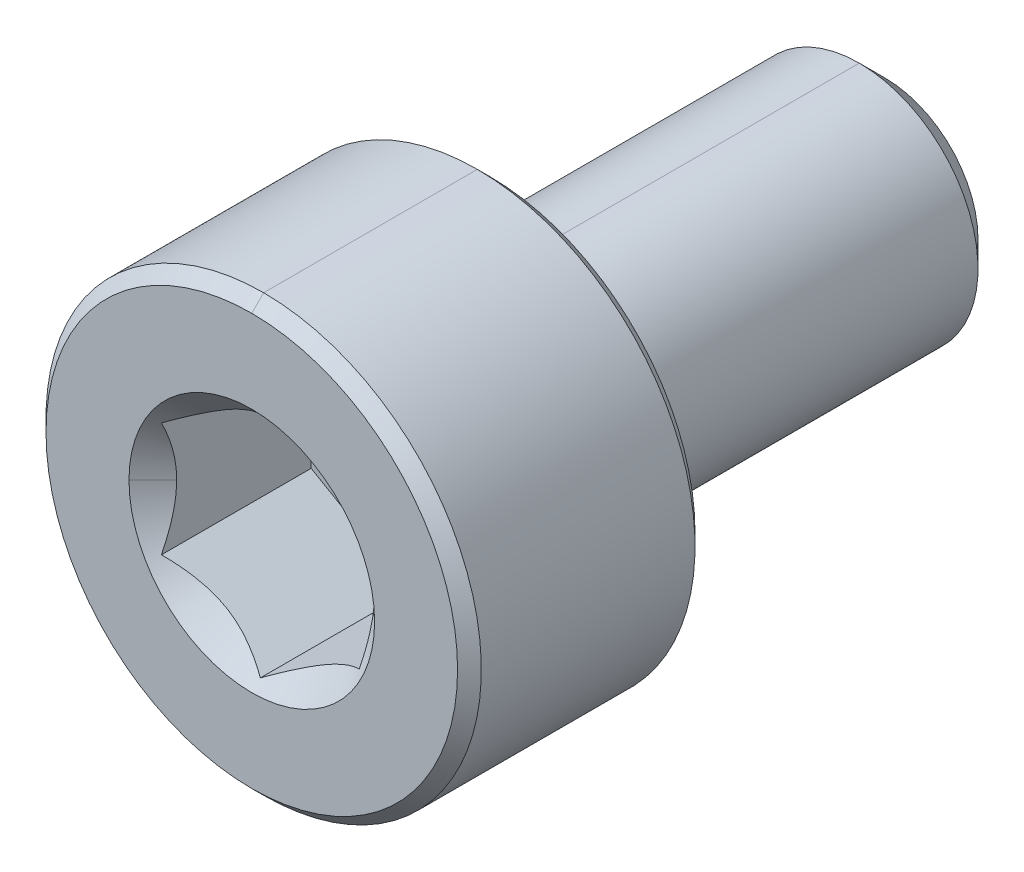
ISO-10303-21;
HEADER;
FILE_DESCRIPTION(('STEP AP214'),'2;1');
FILE_NAME('part.step','',(''),(''),'','','');
FILE_SCHEMA(('AUTOMOTIVE_DESIGN { 1 0 10303 214 1 1 1 1 }'));
ENDSEC;
DATA;
#1=APPLICATION_CONTEXT('core data for automotive mechanical design processes');
#2=APPLICATION_PROTOCOL_DEFINITION('international standard','automotive_design',2000,#1);
#3=PRODUCT_CONTEXT('',#1,'mechanical');
#4=PRODUCT('Part','Part','',(#3));
#5=PRODUCT_RELATED_PRODUCT_CATEGORY('part','',(#4));
#6=PRODUCT_DEFINITION_FORMATION('','',#4);
#7=PRODUCT_DEFINITION_CONTEXT('part definition',#1,'design');
#8=PRODUCT_DEFINITION('design','',#6,#7);
#9=PRODUCT_DEFINITION_SHAPE('','',#8);
#10=(LENGTH_UNIT() NAMED_UNIT(*) SI_UNIT(.MILLI.,.METRE.));
#11=(NAMED_UNIT(*) PLANE_ANGLE_UNIT() SI_UNIT($,.RADIAN.));
#12=(NAMED_UNIT(*) SI_UNIT($,.STERADIAN.) SOLID_ANGLE_UNIT());
#13=UNCERTAINTY_MEASURE_WITH_UNIT(LENGTH_MEASURE(1.E-05),#10,'distance_accuracy_value','');
#14=(GEOMETRIC_REPRESENTATION_CONTEXT(3) GLOBAL_UNCERTAINTY_ASSIGNED_CONTEXT((#13)) GLOBAL_UNIT_ASSIGNED_CONTEXT((#10,
#11,#12)) REPRESENTATION_CONTEXT('',''));
#15=CARTESIAN_POINT('',(0.,0.,0.));
#16=DIRECTION('',(0.,0.,1.));
#17=DIRECTION('',(1.,0.,0.));
#18=AXIS2_PLACEMENT_3D('',#15,#16,#17);
#19=CARTESIAN_POINT('',(1.25,-0.721687836487032,-2.81881307912986));
#20=DIRECTION('',(1.,0.,0.));
#21=DIRECTION('',(0.,-1.,0.));
#22=AXIS2_PLACEMENT_3D('',#19,#20,#21);
#23=PLANE('',#22);
#24=DIRECTION('',(0.,0.,1.));
#25=VECTOR('',#24,1.);
#26=CARTESIAN_POINT('',(1.25,-0.721687836487032,-2.81881307912986));
#27=LINE('',#26,#25);
#28=CARTESIAN_POINT('',(1.25,-0.721687836487032,2.));
#29=VERTEX_POINT('',#28);
#30=CARTESIAN_POINT('',(1.25,-0.721687836487032,3.89174682452694));
#31=VERTEX_POINT('',#30);
#32=EDGE_CURVE('E471',#29,#31,#27,.T.);
#33=ORIENTED_EDGE('',*,*,#32,.T.);
#34=CARTESIAN_POINT('',(1.25,-0.721687836487032,3.89174682452695));
#35=CARTESIAN_POINT('',(1.25,-0.334936490538913,3.69837115155288));
#36=CARTESIAN_POINT('',(1.25,0.,3.69837115155288));
#37=B_SPLINE_CURVE_WITH_KNOTS('',2,(#34,#35,#36),.UNSPECIFIED.,.F.,.F.,(3,3),(0.,1.),.UNSPECIFIED.);
#38=CARTESIAN_POINT('',(1.25,0.,3.69837115155289));
#39=VERTEX_POINT('',#38);
#40=EDGE_CURVE('E460',#31,#39,#37,.T.);
#41=ORIENTED_EDGE('',*,*,#40,.T.);
#42=CARTESIAN_POINT('',(1.25,0.,3.69837115155288));
#43=CARTESIAN_POINT('',(1.25,0.180809106046856,3.69837115155288));
#44=CARTESIAN_POINT('',(1.25,0.371449563482302,3.75239368901567));
#45=CARTESIAN_POINT('',(1.25,0.536554357052694,3.79918008480978));
#46=CARTESIAN_POINT('',(1.25,0.721687836487032,3.89174682452695));
#47=B_SPLINE_CURVE_WITH_KNOTS('',2,(#42,#43,#44,#45,#46),.UNSPECIFIED.,.F.,.F.,(3,2,3),(0.,0.5,
1.),.UNSPECIFIED.);
#48=CARTESIAN_POINT('',(1.25,0.721687836487032,3.89174682452694));
#49=VERTEX_POINT('',#48);
#50=EDGE_CURVE('E280',#39,#49,#47,.T.);
#51=ORIENTED_EDGE('',*,*,#50,.T.);
#52=DIRECTION('',(0.,0.,1.));
#53=VECTOR('',#52,1.);
#54=CARTESIAN_POINT('',(1.25,0.721687836487032,-2.81881307912986));
#55=LINE('',#54,#53);
#56=CARTESIAN_POINT('',(1.25,0.721687836487032,2.));
#57=VERTEX_POINT('',#56);
#58=EDGE_CURVE('E10',#57,#49,#55,.T.);
#59=ORIENTED_EDGE('',*,*,#58,.F.);
#60=DIRECTION('',(0.,1.,0.));
#61=VECTOR('',#60,1.);
#62=CARTESIAN_POINT('',(1.25,-0.721687836487032,2.));
#63=LINE('',#62,#61);
#64=EDGE_CURVE('E279',#29,#57,#63,.T.);
#65=ORIENTED_EDGE('',*,*,#64,.F.);
#66=EDGE_LOOP('',(#33,#41,#51,#59,#65));
#67=FACE_BOUND('',#66,.T.);
#68=ADVANCED_FACE('F15',(#67),#23,.F.);
#69=CARTESIAN_POINT('',(1.25,0.721687836487032,-2.81881307912986));
#70=DIRECTION('',(0.5,0.866025403784439,0.));
#71=DIRECTION('',(0.,0.,-1.));
#72=AXIS2_PLACEMENT_3D('',#69,#70,#71);
#73=PLANE('',#72);
#74=ORIENTED_EDGE('',*,*,#58,.T.);
#75=CARTESIAN_POINT('',(1.25,0.721687836487032,3.89174682452695));
#76=CARTESIAN_POINT('',(0.916560687279088,0.914199113444854,3.69923554756913));
#77=CARTESIAN_POINT('',(0.627302735621754,1.08120226969946,3.69837397959836));
#78=CARTESIAN_POINT('',(0.336432191071905,1.24913645689464,3.6975076084463));
#79=CARTESIAN_POINT('',(0.,1.44337567297406,3.89174682452695));
#80=B_SPLINE_CURVE_WITH_KNOTS('',2,(#75,#76,#77,#78,#79),.UNSPECIFIED.,.F.,.F.,(3,2,3),(0.,0.5,
1.),.UNSPECIFIED.);
#81=CARTESIAN_POINT('',(0.,1.44337567297406,3.89174682452694));
#82=VERTEX_POINT('',#81);
#83=EDGE_CURVE('E532',#49,#82,#80,.T.);
#84=ORIENTED_EDGE('',*,*,#83,.T.);
#85=DIRECTION('',(0.,0.,1.));
#86=VECTOR('',#85,1.);
#87=CARTESIAN_POINT('',(0.,1.44337567297406,-2.81881307912986));
#88=LINE('',#87,#86);
#89=CARTESIAN_POINT('',(0.,1.44337567297406,2.));
#90=VERTEX_POINT('',#89);
#91=EDGE_CURVE('E27',#90,#82,#88,.T.);
#92=ORIENTED_EDGE('',*,*,#91,.F.);
#93=DIRECTION('',(-0.866025403784439,0.5,0.));
#94=VECTOR('',#93,1.);
#95=CARTESIAN_POINT('',(1.25,0.721687836487032,2.));
#96=LINE('',#95,#94);
#97=EDGE_CURVE('E274',#57,#90,#96,.T.);
#98=ORIENTED_EDGE('',*,*,#97,.F.);
#99=EDGE_LOOP('',(#74,#84,#92,#98));
#100=FACE_BOUND('',#99,.T.);
#101=ADVANCED_FACE('F508',(#100),#73,.F.);
#102=CARTESIAN_POINT('',(0.,1.44337567297406,-2.81881307912986));
#103=DIRECTION('',(-0.5,0.866025403784439,0.));
#104=DIRECTION('',(0.,0.,1.));
#105=AXIS2_PLACEMENT_3D('',#102,#103,#104);
#106=PLANE('',#105);
#107=ORIENTED_EDGE('',*,*,#91,.T.);
#108=CARTESIAN_POINT('',(0.,1.44337567297406,3.89174682452695));
#109=CARTESIAN_POINT('',(-0.333439312720449,1.25086439601651,3.6992355475694));
#110=CARTESIAN_POINT('',(-0.622697264378245,1.08386123976164,3.69837397959836));
#111=CARTESIAN_POINT('',(-0.913567808927633,0.915927052566719,3.69750760844603));
#112=CARTESIAN_POINT('',(-1.25,0.721687836487032,3.89174682452695));
#113=B_SPLINE_CURVE_WITH_KNOTS('',2,(#108,#109,#110,#111,#112),.UNSPECIFIED.,.F.,.F.,(3,2,3),
(0.,0.5,1.),.UNSPECIFIED.);
#114=CARTESIAN_POINT('',(-1.25,0.721687836487032,3.89174682452694));
#115=VERTEX_POINT('',#114);
#116=EDGE_CURVE('E533',#82,#115,#113,.T.);
#117=ORIENTED_EDGE('',*,*,#116,.T.);
#118=DIRECTION('',(0.,0.,1.));
#119=VECTOR('',#118,1.);
#120=CARTESIAN_POINT('',(-1.25,0.721687836487032,-2.81881307912986));
#121=LINE('',#120,#119);
#122=CARTESIAN_POINT('',(-1.25,0.721687836487032,2.));
#123=VERTEX_POINT('',#122);
#124=EDGE_CURVE('E52',#123,#115,#121,.T.);
#125=ORIENTED_EDGE('',*,*,#124,.F.);
#126=DIRECTION('',(-0.866025403784439,-0.5,0.));
#127=VECTOR('',#126,1.);
#128=CARTESIAN_POINT('',(0.,1.44337567297406,2.));
#129=LINE('',#128,#127);
#130=EDGE_CURVE('E269',#90,#123,#129,.T.);
#131=ORIENTED_EDGE('',*,*,#130,.F.);
#132=EDGE_LOOP('',(#107,#117,#125,#131));
#133=FACE_BOUND('',#132,.T.);
#134=ADVANCED_FACE('F374',(#133),#106,.F.);
#135=CARTESIAN_POINT('',(-1.25,0.721687836487032,-2.81881307912986));
#136=DIRECTION('',(-1.,0.,0.));
#137=DIRECTION('',(0.,1.,0.));
#138=AXIS2_PLACEMENT_3D('',#135,#136,#137);
#139=PLANE('',#138);
#140=ORIENTED_EDGE('',*,*,#124,.T.);
#141=CARTESIAN_POINT('',(-1.25,0.721687836487032,3.89174682452695));
#142=CARTESIAN_POINT('',(-1.25,0.538824359635457,3.80031508610115));
#143=CARTESIAN_POINT('',(-1.25,0.371449563482303,3.75239368901567));
#144=CARTESIAN_POINT('',(-1.25,0.182765348383529,3.69837115155288));
#145=CARTESIAN_POINT('',(-1.25,0.,3.69837115155288));
#146=B_SPLINE_CURVE_WITH_KNOTS('',2,(#141,#142,#143,#144,#145),.UNSPECIFIED.,.F.,.F.,(3,2,3),
(0.,0.5,1.),.UNSPECIFIED.);
#147=CARTESIAN_POINT('',(-1.25,0.,3.69837115155288));
#148=VERTEX_POINT('',#147);
#149=EDGE_CURVE('E268',#115,#148,#146,.T.);
#150=ORIENTED_EDGE('',*,*,#149,.T.);
#151=CARTESIAN_POINT('',(-1.25,0.,3.69837115155288));
#152=CARTESIAN_POINT('',(-1.25,-0.334936490538916,3.69837115155288));
#153=CARTESIAN_POINT('',(-1.25,-0.721687836487032,3.89174682452695));
#154=B_SPLINE_CURVE_WITH_KNOTS('',2,(#151,#152,#153),.UNSPECIFIED.,.F.,.F.,(3,3),(0.,1.),.UNSPECIFIED.);
#155=CARTESIAN_POINT('',(-1.25,-0.721687836487032,3.89174682452694));
#156=VERTEX_POINT('',#155);
#157=EDGE_CURVE('E392',#148,#156,#154,.T.);
#158=ORIENTED_EDGE('',*,*,#157,.T.);
#159=DIRECTION('',(0.,0.,1.));
#160=VECTOR('',#159,1.);
#161=CARTESIAN_POINT('',(-1.25,-0.721687836487032,-2.81881307912986));
#162=LINE('',#161,#160);
#163=CARTESIAN_POINT('',(-1.25,-0.721687836487033,2.));
#164=VERTEX_POINT('',#163);
#165=EDGE_CURVE('E41',#164,#156,#162,.T.);
#166=ORIENTED_EDGE('',*,*,#165,.F.);
#167=DIRECTION('',(0.,-1.,0.));
#168=VECTOR('',#167,1.);
#169=CARTESIAN_POINT('',(-1.25,0.721687836487032,2.));
#170=LINE('',#169,#168);
#171=EDGE_CURVE('E273',#123,#164,#170,.T.);
#172=ORIENTED_EDGE('',*,*,#171,.F.);
#173=EDGE_LOOP('',(#140,#150,#158,#166,#172));
#174=FACE_BOUND('',#173,.T.);
#175=ADVANCED_FACE('F364',(#174),#139,.F.);
#176=CARTESIAN_POINT('',(-1.25,-0.721687836487032,-2.81881307912986));
#177=DIRECTION('',(-0.5,-0.866025403784439,0.));
#178=DIRECTION('',(-0.866025403784439,0.5,0.));
#179=AXIS2_PLACEMENT_3D('',#176,#177,#178);
#180=PLANE('',#179);
#181=ORIENTED_EDGE('',*,*,#165,.T.);
#182=CARTESIAN_POINT('',(-1.25,-0.721687836487032,3.89174682452695));
#183=CARTESIAN_POINT('',(-0.916560687277686,-0.914199113445663,3.69923554756832));
#184=CARTESIAN_POINT('',(-0.627302735621755,-1.08120226969945,3.69837397959837));
#185=CARTESIAN_POINT('',(-0.336432191070502,-1.24913645689545,3.69750760844712));
#186=CARTESIAN_POINT('',(0.,-1.44337567297406,3.89174682452695));
#187=B_SPLINE_CURVE_WITH_KNOTS('',2,(#182,#183,#184,#185,#186),.UNSPECIFIED.,.F.,.F.,(3,2,3),
(0.,0.5,1.),.UNSPECIFIED.);
#188=CARTESIAN_POINT('',(0.,-1.44337567297406,3.89174682452694));
#189=VERTEX_POINT('',#188);
#190=EDGE_CURVE('E398',#156,#189,#187,.T.);
#191=ORIENTED_EDGE('',*,*,#190,.T.);
#192=DIRECTION('',(0.,0.,1.));
#193=VECTOR('',#192,1.);
#194=CARTESIAN_POINT('',(0.,-1.44337567297406,-2.81881307912986));
#195=LINE('',#194,#193);
#196=CARTESIAN_POINT('',(0.,-1.44337567297406,2.));
#197=VERTEX_POINT('',#196);
#198=EDGE_CURVE('E294',#197,#189,#195,.T.);
#199=ORIENTED_EDGE('',*,*,#198,.F.);
#200=DIRECTION('',(0.866025403784439,-0.5,0.));
#201=VECTOR('',#200,1.);
#202=CARTESIAN_POINT('',(-1.25,-0.721687836487032,2.));
#203=LINE('',#202,#201);
#204=EDGE_CURVE('E290',#164,#197,#203,.T.);
#205=ORIENTED_EDGE('',*,*,#204,.F.);
#206=EDGE_LOOP('',(#181,#191,#199,#205));
#207=FACE_BOUND('',#206,.T.);
#208=ADVANCED_FACE('F373',(#207),#180,.F.);
#209=CARTESIAN_POINT('',(0.,-1.44337567297406,-2.81881307912986));
#210=DIRECTION('',(0.5,-0.866025403784439,0.));
#211=DIRECTION('',(0.,0.,-1.));
#212=AXIS2_PLACEMENT_3D('',#209,#210,#211);
#213=PLANE('',#212);
#214=ORIENTED_EDGE('',*,*,#198,.T.);
#215=CARTESIAN_POINT('',(0.,-1.44337567297406,3.89174682452695));
#216=CARTESIAN_POINT('',(0.333439312721843,-1.2508643960157,3.69923554756859));
#217=CARTESIAN_POINT('',(0.622697264378245,-1.08386123976164,3.69837397959836));
#218=CARTESIAN_POINT('',(0.913567808929029,-0.915927052565913,3.69750760844683));
#219=CARTESIAN_POINT('',(1.25,-0.721687836487032,3.89174682452695));
#220=B_SPLINE_CURVE_WITH_KNOTS('',2,(#215,#216,#217,#218,#219),.UNSPECIFIED.,.F.,.F.,(3,2,3),
(0.,0.5,1.),.UNSPECIFIED.);
#221=EDGE_CURVE('E490',#189,#31,#220,.T.);
#222=ORIENTED_EDGE('',*,*,#221,.T.);
#223=ORIENTED_EDGE('',*,*,#32,.F.);
#224=DIRECTION('',(0.866025403784438,0.5,0.));
#225=VECTOR('',#224,1.);
#226=CARTESIAN_POINT('',(0.,-1.44337567297406,2.));
#227=LINE('',#226,#225);
#228=EDGE_CURVE('E275',#197,#29,#227,.T.);
#229=ORIENTED_EDGE('',*,*,#228,.F.);
#230=EDGE_LOOP('',(#214,#222,#223,#229));
#231=FACE_BOUND('',#230,.T.);
#232=ADVANCED_FACE('F493',(#231),#213,.F.);
#233=CARTESIAN_POINT('',(0.,2.6,2.));
#234=DIRECTION('',(0.,0.,-1.));
#235=DIRECTION('',(-1.,0.,0.));
#236=AXIS2_PLACEMENT_3D('',#233,#234,#235);
#237=PLANE('',#236);
#238=ORIENTED_EDGE('',*,*,#228,.T.);
#239=ORIENTED_EDGE('',*,*,#64,.T.);
#240=ORIENTED_EDGE('',*,*,#97,.T.);
#241=ORIENTED_EDGE('',*,*,#130,.T.);
#242=ORIENTED_EDGE('',*,*,#171,.T.);
#243=ORIENTED_EDGE('',*,*,#204,.T.);
#244=EDGE_LOOP('',(#238,#239,#240,#241,#242,#243));
#245=FACE_BOUND('',#244,.T.);
#246=ADVANCED_FACE('F328',(#245),#237,.F.);
#247=CARTESIAN_POINT('',(0.,0.,4.));
#248=DIRECTION('',(0.,0.,1.));
#249=DIRECTION('',(1.,0.,0.));
#250=AXIS2_PLACEMENT_3D('',#247,#248,#249);
#251=CONICAL_SURFACE('',#250,1.55162884844712,0.78539816339745);
#252=DIRECTION('',(-0.707106781186549,0.,0.707106781186546));
#253=VECTOR('',#252,1.);
#254=CARTESIAN_POINT('',(-1.55162884844712,0.,4.));
#255=LINE('',#254,#253);
#256=CARTESIAN_POINT('',(-1.55162884844712,0.,4.));
#257=VERTEX_POINT('',#256);
#258=EDGE_CURVE('E395',#148,#257,#255,.T.);
#259=ORIENTED_EDGE('',*,*,#258,.F.);
#260=ORIENTED_EDGE('',*,*,#149,.F.);
#261=ORIENTED_EDGE('',*,*,#116,.F.);
#262=ORIENTED_EDGE('',*,*,#83,.F.);
#263=ORIENTED_EDGE('',*,*,#50,.F.);
#264=DIRECTION('',(0.707106781186549,0.,0.707106781186546));
#265=VECTOR('',#264,1.);
#266=CARTESIAN_POINT('',(1.55162884844712,0.,4.));
#267=LINE('',#266,#265);
#268=CARTESIAN_POINT('',(1.55162884844712,0.,4.));
#269=VERTEX_POINT('',#268);
#270=EDGE_CURVE('E315',#39,#269,#267,.T.);
#271=ORIENTED_EDGE('',*,*,#270,.T.);
#272=CARTESIAN_POINT('',(0.,0.,4.));
#273=DIRECTION('',(0.,0.,1.));
#274=DIRECTION('',(1.,0.,0.));
#275=AXIS2_PLACEMENT_3D('',#272,#273,#274);
#276=CIRCLE('',#275,1.55162884844712);
#277=EDGE_CURVE('E265',#269,#257,#276,.T.);
#278=ORIENTED_EDGE('',*,*,#277,.T.);
#279=EDGE_LOOP('',(#259,#260,#261,#262,#263,#271,#278));
#280=FACE_BOUND('',#279,.T.);
#281=ADVANCED_FACE('F317',(#280),#251,.F.);
#282=CARTESIAN_POINT('',(0.,0.,4.));
#283=DIRECTION('',(0.,0.,1.));
#284=DIRECTION('',(0.,-1.,0.));
#285=AXIS2_PLACEMENT_3D('',#282,#283,#284);
#286=PLANE('',#285);
#287=ORIENTED_EDGE('',*,*,#277,.F.);
#288=CARTESIAN_POINT('',(0.,0.,4.));
#289=DIRECTION('',(0.,0.,1.));
#290=DIRECTION('',(1.,0.,0.));
#291=AXIS2_PLACEMENT_3D('',#288,#289,#290);
#292=CIRCLE('',#291,1.55162884844712);
#293=EDGE_CURVE('E405',#257,#269,#292,.T.);
#294=ORIENTED_EDGE('',*,*,#293,.F.);
#295=EDGE_LOOP('',(#287,#294));
#296=FACE_BOUND('',#295,.T.);
#297=CARTESIAN_POINT('',(0.,0.,4.));
#298=DIRECTION('',(0.,0.,-1.));
#299=DIRECTION('',(0.,1.,0.));
#300=AXIS2_PLACEMENT_3D('',#297,#298,#299);
#301=CIRCLE('',#300,2.6);
#302=CARTESIAN_POINT('',(0.,2.6,4.));
#303=VERTEX_POINT('',#302);
#304=CARTESIAN_POINT('',(0.,-2.6,4.));
#305=VERTEX_POINT('',#304);
#306=EDGE_CURVE('E1067',#303,#305,#301,.T.);
#307=ORIENTED_EDGE('',*,*,#306,.F.);
#308=CARTESIAN_POINT('',(0.,0.,4.));
#309=DIRECTION('',(0.,0.,-1.));
#310=DIRECTION('',(0.,1.,0.));
#311=AXIS2_PLACEMENT_3D('',#308,#309,#310);
#312=CIRCLE('',#311,2.6);
#313=EDGE_CURVE('E262',#305,#303,#312,.T.);
#314=ORIENTED_EDGE('',*,*,#313,.F.);
#315=EDGE_LOOP('',(#307,#314));
#316=FACE_BOUND('',#315,.T.);
#317=ADVANCED_FACE('F327',(#296,#316),#286,.T.);
#318=CARTESIAN_POINT('',(0.,0.,3.85));
#319=DIRECTION('',(0.,0.,-1.));
#320=DIRECTION('',(0.,1.,0.));
#321=AXIS2_PLACEMENT_3D('',#318,#319,#320);
#322=CONICAL_SURFACE('',#321,2.75,0.785398163397451);
#323=DIRECTION('',(0.,-0.70710678118655,-0.707106781186546));
#324=VECTOR('',#323,1.);
#325=CARTESIAN_POINT('',(0.,-2.75,3.85));
#326=LINE('',#325,#324);
#327=CARTESIAN_POINT('',(0.,-2.75,3.85));
#328=VERTEX_POINT('',#327);
#329=EDGE_CURVE('E1062',#305,#328,#326,.T.);
#330=ORIENTED_EDGE('',*,*,#329,.F.);
#331=ORIENTED_EDGE('',*,*,#313,.T.);
#332=DIRECTION('',(0.,0.70710678118655,-0.707106781186546));
#333=VECTOR('',#332,1.);
#334=CARTESIAN_POINT('',(0.,2.75,3.85));
#335=LINE('',#334,#333);
#336=CARTESIAN_POINT('',(0.,2.75,3.85));
#337=VERTEX_POINT('',#336);
#338=EDGE_CURVE('E212',#303,#337,#335,.T.);
#339=ORIENTED_EDGE('',*,*,#338,.T.);
#340=CARTESIAN_POINT('',(0.,0.,3.85));
#341=DIRECTION('',(0.,0.,-1.));
#342=DIRECTION('',(0.,1.,0.));
#343=AXIS2_PLACEMENT_3D('',#340,#341,#342);
#344=CIRCLE('',#343,2.75);
#345=EDGE_CURVE('E250',#328,#337,#344,.T.);
#346=ORIENTED_EDGE('',*,*,#345,.F.);
#347=EDGE_LOOP('',(#330,#331,#339,#346));
#348=FACE_BOUND('',#347,.T.);
#349=ADVANCED_FACE('F329',(#348),#322,.T.);
#350=CARTESIAN_POINT('',(0.,0.,-4.));
#351=DIRECTION('',(0.,0.,-1.));
#352=DIRECTION('',(0.,1.,0.));
#353=AXIS2_PLACEMENT_3D('',#350,#351,#352);
#354=CYLINDRICAL_SURFACE('',#353,2.75);
#355=DIRECTION('',(0.,0.,-1.));
#356=VECTOR('',#355,1.);
#357=CARTESIAN_POINT('',(0.,-2.75,-4.));
#358=LINE('',#357,#356);
#359=CARTESIAN_POINT('',(0.,-2.75,1.15));
#360=VERTEX_POINT('',#359);
#361=EDGE_CURVE('E559',#328,#360,#358,.T.);
#362=ORIENTED_EDGE('',*,*,#361,.F.);
#363=ORIENTED_EDGE('',*,*,#345,.T.);
#364=DIRECTION('',(0.,0.,-1.));
#365=VECTOR('',#364,1.);
#366=CARTESIAN_POINT('',(0.,2.75,-4.));
#367=LINE('',#366,#365);
#368=CARTESIAN_POINT('',(0.,2.75,1.15));
#369=VERTEX_POINT('',#368);
#370=EDGE_CURVE('E199',#337,#369,#367,.T.);
#371=ORIENTED_EDGE('',*,*,#370,.T.);
#372=CARTESIAN_POINT('',(0.,0.,1.15));
#373=DIRECTION('',(0.,0.,-1.));
#374=DIRECTION('',(0.,1.,0.));
#375=AXIS2_PLACEMENT_3D('',#372,#373,#374);
#376=CIRCLE('',#375,2.75);
#377=EDGE_CURVE('E185',#360,#369,#376,.T.);
#378=ORIENTED_EDGE('',*,*,#377,.F.);
#379=EDGE_LOOP('',(#362,#363,#371,#378));
#380=FACE_BOUND('',#379,.T.);
#381=ADVANCED_FACE('F519',(#380),#354,.T.);
#382=CARTESIAN_POINT('',(0.,0.,1.));
#383=DIRECTION('',(0.,0.,1.));
#384=DIRECTION('',(0.,-1.,0.));
#385=AXIS2_PLACEMENT_3D('',#382,#383,#384);
#386=CONICAL_SURFACE('',#385,2.6,0.785398163397448);
#387=DIRECTION('',(0.,0.707106781186548,0.707106781186548));
#388=VECTOR('',#387,1.);
#389=CARTESIAN_POINT('',(0.,2.6,1.));
#390=LINE('',#389,#388);
#391=CARTESIAN_POINT('',(0.,2.6,1.));
#392=VERTEX_POINT('',#391);
#393=EDGE_CURVE('E180',#392,#369,#390,.T.);
#394=ORIENTED_EDGE('',*,*,#393,.F.);
#395=CARTESIAN_POINT('',(0.,0.,1.));
#396=DIRECTION('',(0.,0.,-1.));
#397=DIRECTION('',(0.,1.,0.));
#398=AXIS2_PLACEMENT_3D('',#395,#396,#397);
#399=CIRCLE('',#398,2.6);
#400=CARTESIAN_POINT('',(0.,-2.6,1.));
#401=VERTEX_POINT('',#400);
#402=EDGE_CURVE('E174',#401,#392,#399,.T.);
#403=ORIENTED_EDGE('',*,*,#402,.F.);
#404=DIRECTION('',(0.,-0.707106781186548,0.707106781186548));
#405=VECTOR('',#404,1.);
#406=CARTESIAN_POINT('',(0.,-2.6,1.));
#407=LINE('',#406,#405);
#408=EDGE_CURVE('E177',#401,#360,#407,.T.);
#409=ORIENTED_EDGE('',*,*,#408,.T.);
#410=ORIENTED_EDGE('',*,*,#377,.T.);
#411=EDGE_LOOP('',(#394,#403,#409,#410));
#412=FACE_BOUND('',#411,.T.);
#413=ADVANCED_FACE('F176',(#412),#386,.T.);
#414=CARTESIAN_POINT('',(0.,2.6,1.));
#415=DIRECTION('',(0.,0.,-1.));
#416=DIRECTION('',(-1.,0.,0.));
#417=AXIS2_PLACEMENT_3D('',#414,#415,#416);
#418=PLANE('',#417);
#419=CARTESIAN_POINT('',(0.,0.,1.));
#420=DIRECTION('',(0.,0.,-1.));
#421=DIRECTION('',(0.,1.,0.));
#422=AXIS2_PLACEMENT_3D('',#419,#420,#421);
#423=CIRCLE('',#422,1.65);
#424=CARTESIAN_POINT('',(0.,1.65,1.));
#425=VERTEX_POINT('',#424);
#426=CARTESIAN_POINT('',(0.,-1.65,1.));
#427=VERTEX_POINT('',#426);
#428=EDGE_CURVE('E186',#425,#427,#423,.T.);
#429=ORIENTED_EDGE('',*,*,#428,.F.);
#430=CARTESIAN_POINT('',(0.,0.,1.));
#431=DIRECTION('',(0.,0.,-1.));
#432=DIRECTION('',(0.,1.,0.));
#433=AXIS2_PLACEMENT_3D('',#430,#431,#432);
#434=CIRCLE('',#433,1.65);
#435=EDGE_CURVE('E226',#427,#425,#434,.T.);
#436=ORIENTED_EDGE('',*,*,#435,.F.);
#437=EDGE_LOOP('',(#429,#436));
#438=FACE_BOUND('',#437,.T.);
#439=ORIENTED_EDGE('',*,*,#402,.T.);
#440=CARTESIAN_POINT('',(0.,0.,1.));
#441=DIRECTION('',(0.,0.,-1.));
#442=DIRECTION('',(0.,1.,0.));
#443=AXIS2_PLACEMENT_3D('',#440,#441,#442);
#444=CIRCLE('',#443,2.6);
#445=EDGE_CURVE('E190',#392,#401,#444,.T.);
#446=ORIENTED_EDGE('',*,*,#445,.T.);
#447=EDGE_LOOP('',(#439,#446));
#448=FACE_BOUND('',#447,.T.);
#449=ADVANCED_FACE('F197',(#438,#448),#418,.T.);
#450=CARTESIAN_POINT('',(0.,0.,0.85));
#451=DIRECTION('',(0.,0.,-1.));
#452=DIRECTION('',(0.,1.,0.));
#453=AXIS2_PLACEMENT_3D('',#450,#451,#452);
#454=TOROIDAL_SURFACE('',#453,1.65,0.15);
#455=CARTESIAN_POINT('',(0.,-1.65,0.85));
#456=DIRECTION('',(1.,0.,0.));
#457=DIRECTION('',(0.,1.,0.));
#458=AXIS2_PLACEMENT_3D('',#455,#456,#457);
#459=CIRCLE('',#458,0.15);
#460=CARTESIAN_POINT('',(0.,-1.5,0.85));
#461=VERTEX_POINT('',#460);
#462=EDGE_CURVE('E222',#461,#427,#459,.T.);
#463=ORIENTED_EDGE('',*,*,#462,.F.);
#464=CARTESIAN_POINT('',(0.,0.,0.85));
#465=DIRECTION('',(0.,0.,-1.));
#466=DIRECTION('',(0.,1.,0.));
#467=AXIS2_PLACEMENT_3D('',#464,#465,#466);
#468=CIRCLE('',#467,1.5);
#469=CARTESIAN_POINT('',(0.,1.5,0.85));
#470=VERTEX_POINT('',#469);
#471=EDGE_CURVE('E234',#470,#461,#468,.T.);
#472=ORIENTED_EDGE('',*,*,#471,.F.);
#473=CARTESIAN_POINT('',(0.,1.65,0.85));
#474=DIRECTION('',(-1.,0.,0.));
#475=DIRECTION('',(0.,0.,1.));
#476=AXIS2_PLACEMENT_3D('',#473,#474,#475);
#477=CIRCLE('',#476,0.15);
#478=EDGE_CURVE('E230',#470,#425,#477,.T.);
#479=ORIENTED_EDGE('',*,*,#478,.T.);
#480=ORIENTED_EDGE('',*,*,#428,.T.);
#481=EDGE_LOOP('',(#463,#472,#479,#480));
#482=FACE_BOUND('',#481,.T.);
#483=ADVANCED_FACE('F665',(#482),#454,.F.);
#484=CARTESIAN_POINT('',(0.,0.,-4.));
#485=DIRECTION('',(0.,0.,-1.));
#486=DIRECTION('',(0.,1.,0.));
#487=AXIS2_PLACEMENT_3D('',#484,#485,#486);
#488=CYLINDRICAL_SURFACE('',#487,1.5);
#489=DIRECTION('',(0.,0.,-1.));
#490=VECTOR('',#489,1.);
#491=CARTESIAN_POINT('',(0.,-1.5,-4.));
#492=LINE('',#491,#490);
#493=CARTESIAN_POINT('',(0.,-1.5,-3.67524047358083));
#494=VERTEX_POINT('',#493);
#495=EDGE_CURVE('E238',#461,#494,#492,.T.);
#496=ORIENTED_EDGE('',*,*,#495,.F.);
#497=CARTESIAN_POINT('',(0.,0.,0.85));
#498=DIRECTION('',(0.,0.,-1.));
#499=DIRECTION('',(0.,1.,0.));
#500=AXIS2_PLACEMENT_3D('',#497,#498,#499);
#501=CIRCLE('',#500,1.5);
#502=EDGE_CURVE('E195',#461,#470,#501,.T.);
#503=ORIENTED_EDGE('',*,*,#502,.T.);
#504=DIRECTION('',(0.,0.,-1.));
#505=VECTOR('',#504,1.);
#506=CARTESIAN_POINT('',(0.,1.5,-4.));
#507=LINE('',#506,#505);
#508=CARTESIAN_POINT('',(0.,1.5,-3.67524047358083));
#509=VERTEX_POINT('',#508);
#510=EDGE_CURVE('E243',#470,#509,#507,.T.);
#511=ORIENTED_EDGE('',*,*,#510,.T.);
#512=CARTESIAN_POINT('',(0.,0.,-3.67524047358083));
#513=DIRECTION('',(0.,0.,-1.));
#514=DIRECTION('',(0.,1.,0.));
#515=AXIS2_PLACEMENT_3D('',#512,#513,#514);
#516=CIRCLE('',#515,1.5);
#517=EDGE_CURVE('E259',#494,#509,#516,.T.);
#518=ORIENTED_EDGE('',*,*,#517,.F.);
#519=EDGE_LOOP('',(#496,#503,#511,#518));
#520=FACE_BOUND('',#519,.T.);
#521=ADVANCED_FACE('F669',(#520),#488,.T.);
#522=CARTESIAN_POINT('',(0.,0.,-4.));
#523=DIRECTION('',(0.,0.,1.));
#524=DIRECTION('',(0.,-1.,0.));
#525=AXIS2_PLACEMENT_3D('',#522,#523,#524);
#526=CONICAL_SURFACE('',#525,1.17524047358083,0.785398163397443);
#527=DIRECTION('',(0.,0.707106781186544,0.707106781186551));
#528=VECTOR('',#527,1.);
#529=CARTESIAN_POINT('',(0.,1.17524047358083,-4.));
#530=LINE('',#529,#528);
#531=CARTESIAN_POINT('',(0.,1.17524047358083,-4.));
#532=VERTEX_POINT('',#531);
#533=EDGE_CURVE('E217',#532,#509,#530,.T.);
#534=ORIENTED_EDGE('',*,*,#533,.F.);
#535=CARTESIAN_POINT('',(0.,0.,-4.));
#536=DIRECTION('',(0.,0.,-1.));
#537=DIRECTION('',(0.,1.,0.));
#538=AXIS2_PLACEMENT_3D('',#535,#536,#537);
#539=CIRCLE('',#538,1.17524047358083);
#540=CARTESIAN_POINT('',(0.,-1.17524047358083,-4.));
#541=VERTEX_POINT('',#540);
#542=EDGE_CURVE('E216',#541,#532,#539,.T.);
#543=ORIENTED_EDGE('',*,*,#542,.F.);
#544=DIRECTION('',(0.,-0.707106781186544,0.707106781186551));
#545=VECTOR('',#544,1.);
#546=CARTESIAN_POINT('',(0.,-1.17524047358083,-4.));
#547=LINE('',#546,#545);
#548=EDGE_CURVE('E214',#541,#494,#547,.T.);
#549=ORIENTED_EDGE('',*,*,#548,.T.);
#550=ORIENTED_EDGE('',*,*,#517,.T.);
#551=EDGE_LOOP('',(#534,#543,#549,#550));
#552=FACE_BOUND('',#551,.T.);
#553=ADVANCED_FACE('F700',(#552),#526,.T.);
#554=CARTESIAN_POINT('',(0.,1.17524047358083,-4.));
#555=DIRECTION('',(0.,0.,-1.));
#556=DIRECTION('',(-1.,0.,0.));
#557=AXIS2_PLACEMENT_3D('',#554,#555,#556);
#558=PLANE('',#557);
#559=ORIENTED_EDGE('',*,*,#542,.T.);
#560=CARTESIAN_POINT('',(0.,0.,-4.));
#561=DIRECTION('',(0.,0.,-1.));
#562=DIRECTION('',(0.,1.,0.));
#563=AXIS2_PLACEMENT_3D('',#560,#561,#562);
#564=CIRCLE('',#563,1.17524047358083);
#565=EDGE_CURVE('E247',#532,#541,#564,.T.);
#566=ORIENTED_EDGE('',*,*,#565,.T.);
#567=EDGE_LOOP('',(#559,#566));
#568=FACE_BOUND('',#567,.T.);
#569=ADVANCED_FACE('F735',(#568),#558,.T.);
#570=CARTESIAN_POINT('',(0.,0.,-4.));
#571=DIRECTION('',(0.,0.,1.));
#572=DIRECTION('',(0.,-1.,0.));
#573=AXIS2_PLACEMENT_3D('',#570,#571,#572);
#574=CONICAL_SURFACE('',#573,1.17524047358083,0.785398163397443);
#575=ORIENTED_EDGE('',*,*,#565,.F.);
#576=ORIENTED_EDGE('',*,*,#533,.T.);
#577=CARTESIAN_POINT('',(0.,0.,-3.67524047358083));
#578=DIRECTION('',(0.,0.,-1.));
#579=DIRECTION('',(0.,1.,0.));
#580=AXIS2_PLACEMENT_3D('',#577,#578,#579);
#581=CIRCLE('',#580,1.5);
#582=EDGE_CURVE('E242',#509,#494,#581,.T.);
#583=ORIENTED_EDGE('',*,*,#582,.T.);
#584=ORIENTED_EDGE('',*,*,#548,.F.);
#585=EDGE_LOOP('',(#575,#576,#583,#584));
#586=FACE_BOUND('',#585,.T.);
#587=ADVANCED_FACE('F710',(#586),#574,.T.);
#588=CARTESIAN_POINT('',(0.,0.,-4.));
#589=DIRECTION('',(0.,0.,-1.));
#590=DIRECTION('',(0.,1.,0.));
#591=AXIS2_PLACEMENT_3D('',#588,#589,#590);
#592=CYLINDRICAL_SURFACE('',#591,1.5);
#593=ORIENTED_EDGE('',*,*,#471,.T.);
#594=ORIENTED_EDGE('',*,*,#495,.T.);
#595=ORIENTED_EDGE('',*,*,#582,.F.);
#596=ORIENTED_EDGE('',*,*,#510,.F.);
#597=EDGE_LOOP('',(#593,#594,#595,#596));
#598=FACE_BOUND('',#597,.T.);
#599=ADVANCED_FACE('F706',(#598),#592,.T.);
#600=CARTESIAN_POINT('',(0.,0.,0.85));
#601=DIRECTION('',(0.,0.,-1.));
#602=DIRECTION('',(0.,1.,0.));
#603=AXIS2_PLACEMENT_3D('',#600,#601,#602);
#604=TOROIDAL_SURFACE('',#603,1.65,0.15);
#605=ORIENTED_EDGE('',*,*,#502,.F.);
#606=ORIENTED_EDGE('',*,*,#462,.T.);
#607=ORIENTED_EDGE('',*,*,#435,.T.);
#608=ORIENTED_EDGE('',*,*,#478,.F.);
#609=EDGE_LOOP('',(#605,#606,#607,#608));
#610=FACE_BOUND('',#609,.T.);
#611=ADVANCED_FACE('F692',(#610),#604,.F.);
#612=CARTESIAN_POINT('',(0.,0.,1.));
#613=DIRECTION('',(0.,0.,1.));
#614=DIRECTION('',(0.,-1.,0.));
#615=AXIS2_PLACEMENT_3D('',#612,#613,#614);
#616=CONICAL_SURFACE('',#615,2.6,0.785398163397448);
#617=ORIENTED_EDGE('',*,*,#445,.F.);
#618=ORIENTED_EDGE('',*,*,#393,.T.);
#619=CARTESIAN_POINT('',(0.,0.,1.15));
#620=DIRECTION('',(0.,0.,-1.));
#621=DIRECTION('',(0.,1.,0.));
#622=AXIS2_PLACEMENT_3D('',#619,#620,#621);
#623=CIRCLE('',#622,2.75);
#624=EDGE_CURVE('E192',#369,#360,#623,.T.);
#625=ORIENTED_EDGE('',*,*,#624,.T.);
#626=ORIENTED_EDGE('',*,*,#408,.F.);
#627=EDGE_LOOP('',(#617,#618,#625,#626));
#628=FACE_BOUND('',#627,.T.);
#629=ADVANCED_FACE('F189',(#628),#616,.T.);
#630=CARTESIAN_POINT('',(0.,0.,-4.));
#631=DIRECTION('',(0.,0.,-1.));
#632=DIRECTION('',(0.,1.,0.));
#633=AXIS2_PLACEMENT_3D('',#630,#631,#632);
#634=CYLINDRICAL_SURFACE('',#633,2.75);
#635=CARTESIAN_POINT('',(0.,0.,3.85));
#636=DIRECTION('',(0.,0.,-1.));
#637=DIRECTION('',(0.,1.,0.));
#638=AXIS2_PLACEMENT_3D('',#635,#636,#637);
#639=CIRCLE('',#638,2.75);
#640=EDGE_CURVE('E560',#337,#328,#639,.T.);
#641=ORIENTED_EDGE('',*,*,#640,.T.);
#642=ORIENTED_EDGE('',*,*,#361,.T.);
#643=ORIENTED_EDGE('',*,*,#624,.F.);
#644=ORIENTED_EDGE('',*,*,#370,.F.);
#645=EDGE_LOOP('',(#641,#642,#643,#644));
#646=FACE_BOUND('',#645,.T.);
#647=ADVANCED_FACE('F660',(#646),#634,.T.);
#648=CARTESIAN_POINT('',(0.,0.,3.85));
#649=DIRECTION('',(0.,0.,-1.));
#650=DIRECTION('',(0.,1.,0.));
#651=AXIS2_PLACEMENT_3D('',#648,#649,#650);
#652=CONICAL_SURFACE('',#651,2.75,0.785398163397451);
#653=ORIENTED_EDGE('',*,*,#306,.T.);
#654=ORIENTED_EDGE('',*,*,#329,.T.);
#655=ORIENTED_EDGE('',*,*,#640,.F.);
#656=ORIENTED_EDGE('',*,*,#338,.F.);
#657=EDGE_LOOP('',(#653,#654,#655,#656));
#658=FACE_BOUND('',#657,.T.);
#659=ADVANCED_FACE('F439',(#658),#652,.T.);
#660=CARTESIAN_POINT('',(0.,0.,4.));
#661=DIRECTION('',(0.,0.,1.));
#662=DIRECTION('',(1.,0.,0.));
#663=AXIS2_PLACEMENT_3D('',#660,#661,#662);
#664=CONICAL_SURFACE('',#663,1.55162884844712,0.78539816339745);
#665=ORIENTED_EDGE('',*,*,#157,.F.);
#666=ORIENTED_EDGE('',*,*,#258,.T.);
#667=ORIENTED_EDGE('',*,*,#293,.T.);
#668=ORIENTED_EDGE('',*,*,#270,.F.);
#669=ORIENTED_EDGE('',*,*,#40,.F.);
#670=ORIENTED_EDGE('',*,*,#221,.F.);
#671=ORIENTED_EDGE('',*,*,#190,.F.);
#672=EDGE_LOOP('',(#665,#666,#667,#668,#669,#670,#671));
#673=FACE_BOUND('',#672,.T.);
#674=ADVANCED_FACE('F393',(#673),#664,.F.);
#675=CLOSED_SHELL('',(#68,#101,#134,#175,#208,#232,#246,#281,#317,#349,#381,#413,#449,#483,#521,
#553,#569,#587,#599,#611,#629,#647,#659,#674));
#676=MANIFOLD_SOLID_BREP('B1',#675);
#677=ADVANCED_BREP_SHAPE_REPRESENTATION('',(#18,#676),#14);
#678=SHAPE_DEFINITION_REPRESENTATION(#9,#677);
ENDSEC;
END-ISO-10303-21;
